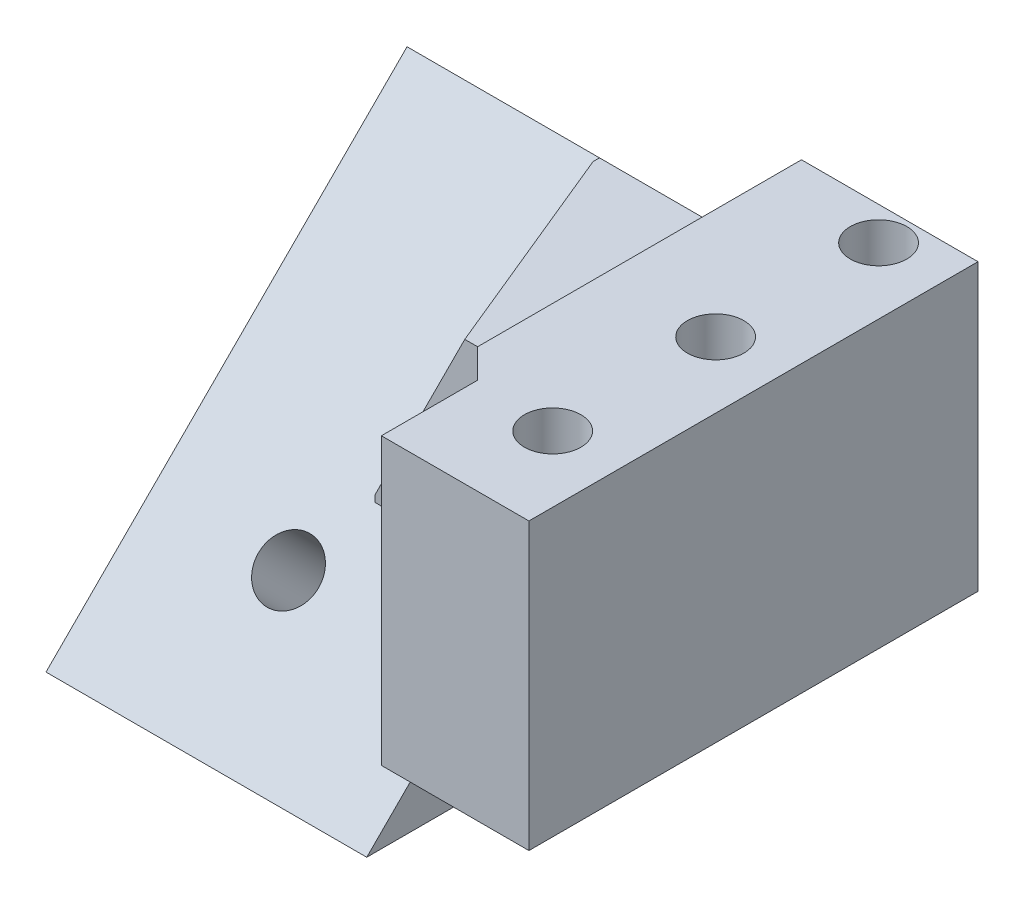
ISO-10303-21;
HEADER;
FILE_DESCRIPTION(('STEP AP214'),'2;1');
FILE_NAME('part.step','',(''),(''),'','','');
FILE_SCHEMA(('AUTOMOTIVE_DESIGN { 1 0 10303 214 1 1 1 1 }'));
ENDSEC;
DATA;
#1=APPLICATION_CONTEXT('core data for automotive mechanical design processes');
#2=APPLICATION_PROTOCOL_DEFINITION('international standard','automotive_design',2000,#1);
#3=PRODUCT_CONTEXT('',#1,'mechanical');
#4=PRODUCT('Part','Part','',(#3));
#5=PRODUCT_RELATED_PRODUCT_CATEGORY('part','',(#4));
#6=PRODUCT_DEFINITION_FORMATION('','',#4);
#7=PRODUCT_DEFINITION_CONTEXT('part definition',#1,'design');
#8=PRODUCT_DEFINITION('design','',#6,#7);
#9=PRODUCT_DEFINITION_SHAPE('','',#8);
#10=(LENGTH_UNIT() NAMED_UNIT(*) SI_UNIT(.MILLI.,.METRE.));
#11=(NAMED_UNIT(*) PLANE_ANGLE_UNIT() SI_UNIT($,.RADIAN.));
#12=(NAMED_UNIT(*) SI_UNIT($,.STERADIAN.) SOLID_ANGLE_UNIT());
#13=UNCERTAINTY_MEASURE_WITH_UNIT(LENGTH_MEASURE(1.E-05),#10,'distance_accuracy_value','');
#14=(GEOMETRIC_REPRESENTATION_CONTEXT(3) GLOBAL_UNCERTAINTY_ASSIGNED_CONTEXT((#13)) GLOBAL_UNIT_ASSIGNED_CONTEXT((#10,
#11,#12)) REPRESENTATION_CONTEXT('',''));
#15=CARTESIAN_POINT('',(0.,0.,0.));
#16=DIRECTION('',(0.,0.,1.));
#17=DIRECTION('',(1.,0.,0.));
#18=AXIS2_PLACEMENT_3D('',#15,#16,#17);
#19=CARTESIAN_POINT('',(-18.,0.,0.));
#20=DIRECTION('',(-1.,0.,0.));
#21=DIRECTION('',(0.,0.,1.));
#22=AXIS2_PLACEMENT_3D('',#19,#20,#21);
#23=PLANE('',#22);
#24=DIRECTION('',(0.,1.,0.));
#25=VECTOR('',#24,1.);
#26=CARTESIAN_POINT('',(-18.,-11.125,0.));
#27=LINE('',#26,#25);
#28=CARTESIAN_POINT('',(-18.,-11.125,0.));
#29=VERTEX_POINT('',#28);
#30=CARTESIAN_POINT('',(-18.,-10.6166544701878,0.));
#31=VERTEX_POINT('',#30);
#32=EDGE_CURVE('E152',#29,#31,#27,.T.);
#33=ORIENTED_EDGE('',*,*,#32,.T.);
#34=DIRECTION('',(0.,0.6357072528611,-0.77193023561705));
#35=VECTOR('',#34,1.);
#36=CARTESIAN_POINT('',(-18.,-6.3262126636789,-5.20982219361792));
#37=LINE('',#36,#35);
#38=CARTESIAN_POINT('',(-18.,3.38334552981223,-17.));
#39=VERTEX_POINT('',#38);
#40=EDGE_CURVE('E11',#31,#39,#37,.T.);
#41=ORIENTED_EDGE('',*,*,#40,.T.);
#42=DIRECTION('',(0.,0.,-1.));
#43=VECTOR('',#42,1.);
#44=CARTESIAN_POINT('',(-18.,3.38334552981223,0.));
#45=LINE('',#44,#43);
#46=CARTESIAN_POINT('',(-18.,3.38334552981223,-17.5));
#47=VERTEX_POINT('',#46);
#48=EDGE_CURVE('E161',#39,#47,#45,.T.);
#49=ORIENTED_EDGE('',*,*,#48,.T.);
#50=DIRECTION('',(0.,0.707106781186548,-0.707106781186548));
#51=VECTOR('',#50,1.);
#52=CARTESIAN_POINT('',(-18.,3.38334552981223,-17.5));
#53=LINE('',#52,#51);
#54=CARTESIAN_POINT('',(-18.,-11.125,-2.99165447018778));
#55=VERTEX_POINT('',#54);
#56=EDGE_CURVE('E234',#55,#47,#53,.T.);
#57=ORIENTED_EDGE('',*,*,#56,.F.);
#58=DIRECTION('',(0.,0.,1.));
#59=VECTOR('',#58,1.);
#60=CARTESIAN_POINT('',(-18.,-11.125,-17.5));
#61=LINE('',#60,#59);
#62=EDGE_CURVE('E160',#55,#29,#61,.T.);
#63=ORIENTED_EDGE('',*,*,#62,.T.);
#64=EDGE_LOOP('',(#33,#41,#49,#57,#63));
#65=FACE_BOUND('',#64,.T.);
#66=ADVANCED_FACE('F32',(#65),#23,.T.);
#67=CARTESIAN_POINT('',(-33.,-24.7559644177361,-17.5));
#68=DIRECTION('',(0.,1.,0.));
#69=DIRECTION('',(0.,0.,1.));
#70=AXIS2_PLACEMENT_3D('',#67,#68,#69);
#71=PLANE('',#70);
#72=DIRECTION('',(1.,0.,0.));
#73=VECTOR('',#72,1.);
#74=CARTESIAN_POINT('',(-33.,-24.7559644177361,-17.5));
#75=LINE('',#74,#73);
#76=CARTESIAN_POINT('',(-33.,-24.7559644177361,-17.5));
#77=VERTEX_POINT('',#76);
#78=CARTESIAN_POINT('',(-8.,-24.7559644177361,-17.5));
#79=VERTEX_POINT('',#78);
#80=EDGE_CURVE('E292',#77,#79,#75,.T.);
#81=ORIENTED_EDGE('',*,*,#80,.T.);
#82=DIRECTION('',(0.,0.,-1.));
#83=VECTOR('',#82,1.);
#84=CARTESIAN_POINT('',(-8.,-24.7559644177361,10.6393099475483));
#85=LINE('',#84,#83);
#86=CARTESIAN_POINT('',(-8.,-24.7559644177361,10.6393099475483));
#87=VERTEX_POINT('',#86);
#88=EDGE_CURVE('E272',#87,#79,#85,.T.);
#89=ORIENTED_EDGE('',*,*,#88,.F.);
#90=DIRECTION('',(1.,0.,0.));
#91=VECTOR('',#90,1.);
#92=CARTESIAN_POINT('',(-33.,-24.7559644177361,10.6393099475483));
#93=LINE('',#92,#91);
#94=CARTESIAN_POINT('',(-33.,-24.7559644177361,10.6393099475483));
#95=VERTEX_POINT('',#94);
#96=EDGE_CURVE('E287',#95,#87,#93,.T.);
#97=ORIENTED_EDGE('',*,*,#96,.F.);
#98=DIRECTION('',(0.,0.,1.));
#99=VECTOR('',#98,1.);
#100=CARTESIAN_POINT('',(-33.,-24.7559644177361,-17.5));
#101=LINE('',#100,#99);
#102=EDGE_CURVE('E285',#77,#95,#101,.T.);
#103=ORIENTED_EDGE('',*,*,#102,.F.);
#104=EDGE_LOOP('',(#81,#89,#97,#103));
#105=FACE_BOUND('',#104,.T.);
#106=DIRECTION('',(-1.,0.,0.));
#107=VECTOR('',#106,1.);
#108=CARTESIAN_POINT('',(-33.,-24.7559644177361,-3.36055635968479));
#109=LINE('',#108,#107);
#110=CARTESIAN_POINT('',(-19.0604235533083,-24.7559644177361,-3.36055635968479));
#111=VERTEX_POINT('',#110);
#112=CARTESIAN_POINT('',(-20.5725978708569,-24.7559644177361,-3.36055635968479));
#113=VERTEX_POINT('',#112);
#114=EDGE_CURVE('E53',#111,#113,#109,.T.);
#115=ORIENTED_EDGE('',*,*,#114,.F.);
#116=CARTESIAN_POINT('',(-22.2572766579003,-24.7559644177361,-6.52310238399309));
#117=DIRECTION('',(0.,1.,0.));
#118=DIRECTION('',(0.,0.,1.));
#119=AXIS2_PLACEMENT_3D('',#116,#117,#118);
#120=ELLIPSE('',#119,4.8761873239032,4.2);
#121=CARTESIAN_POINT('',(-25.4541297624924,-24.7559644177361,-3.36055635968479));
#122=VERTEX_POINT('',#121);
#123=EDGE_CURVE('E156',#122,#111,#120,.F.);
#124=ORIENTED_EDGE('',*,*,#123,.F.);
#125=CARTESIAN_POINT('',(-23.9419554449439,-24.7559644177361,-3.36055635968479));
#126=VERTEX_POINT('',#125);
#127=EDGE_CURVE('E263',#126,#122,#109,.T.);
#128=ORIENTED_EDGE('',*,*,#127,.F.);
#129=CARTESIAN_POINT('',(-22.2572766579004,-24.7559644177361,-5.67760507927857));
#130=DIRECTION('',(0.,1.,0.));
#131=DIRECTION('',(0.,0.,1.));
#132=AXIS2_PLACEMENT_3D('',#129,#130,#131);
#133=ELLIPSE('',#132,3.32340187157677,2.35);
#134=EDGE_CURVE('E249',#126,#113,#133,.T.);
#135=ORIENTED_EDGE('',*,*,#134,.T.);
#136=EDGE_LOOP('',(#115,#124,#128,#135));
#137=FACE_BOUND('',#136,.T.);
#138=ADVANCED_FACE('F265',(#105,#137),#71,.F.);
#139=CARTESIAN_POINT('',(-22.2572766579004,-28.618322184494,-9.53996284603643));
#140=DIRECTION('',(0.,0.707106781186548,0.707106781186547));
#141=DIRECTION('',(0.,-0.707106781186547,0.707106781186548));
#142=AXIS2_PLACEMENT_3D('',#139,#140,#141);
#143=CYLINDRICAL_SURFACE('',#142,2.35);
#144=CARTESIAN_POINT('',(-22.2572766579004,-16.5975069043226,2.48085243413488));
#145=DIRECTION('',(0.,0.707106781186548,0.707106781186547));
#146=DIRECTION('',(0.,-0.707106781186547,0.707106781186548));
#147=AXIS2_PLACEMENT_3D('',#144,#145,#146);
#148=CIRCLE('',#147,2.35);
#149=CARTESIAN_POINT('',(-22.2572766579004,-18.259207840111,4.14255336992326));
#150=VERTEX_POINT('',#149);
#151=EDGE_CURVE('E253',#150,#150,#148,.T.);
#152=ORIENTED_EDGE('',*,*,#151,.T.);
#153=EDGE_LOOP('',(#152));
#154=FACE_BOUND('',#153,.T.);
#155=CARTESIAN_POINT('',(-22.2572766579004,-23.8963235517584,-4.81796421330083));
#156=DIRECTION('',(0.,-0.861328681818987,-0.508048129487715));
#157=DIRECTION('',(0.,-0.508048129487715,0.861328681818987));
#158=AXIS2_PLACEMENT_3D('',#155,#156,#157);
#159=ELLIPSE('',#158,2.42694475628332,2.35);
#160=EDGE_CURVE('E248',#113,#126,#159,.F.);
#161=ORIENTED_EDGE('',*,*,#160,.F.);
#162=ORIENTED_EDGE('',*,*,#134,.F.);
#163=EDGE_LOOP('',(#161,#162));
#164=FACE_BOUND('',#163,.T.);
#165=ADVANCED_FACE('F331',(#154,#164),#143,.F.);
#166=CARTESIAN_POINT('',(11.5,-11.125,17.5));
#167=DIRECTION('',(0.,1.,0.));
#168=DIRECTION('',(0.,0.,1.));
#169=AXIS2_PLACEMENT_3D('',#166,#167,#168);
#170=PLANE('',#169);
#171=CARTESIAN_POINT('',(6.35,-11.125,-14.9));
#172=DIRECTION('',(0.,1.,0.));
#173=DIRECTION('',(0.,0.,1.));
#174=AXIS2_PLACEMENT_3D('',#171,#172,#173);
#175=CIRCLE('',#174,2.2);
#176=CARTESIAN_POINT('',(6.35,-11.125,-12.7));
#177=VERTEX_POINT('',#176);
#178=EDGE_CURVE('E213',#177,#177,#175,.T.);
#179=ORIENTED_EDGE('',*,*,#178,.T.);
#180=EDGE_LOOP('',(#179));
#181=FACE_BOUND('',#180,.T.);
#182=CARTESIAN_POINT('',(6.35,-11.125,10.5));
#183=DIRECTION('',(0.,1.,0.));
#184=DIRECTION('',(0.,0.,1.));
#185=AXIS2_PLACEMENT_3D('',#182,#183,#184);
#186=CIRCLE('',#185,2.2);
#187=CARTESIAN_POINT('',(6.35,-11.125,12.7));
#188=VERTEX_POINT('',#187);
#189=EDGE_CURVE('E181',#188,#188,#186,.T.);
#190=ORIENTED_EDGE('',*,*,#189,.T.);
#191=EDGE_LOOP('',(#190));
#192=FACE_BOUND('',#191,.T.);
#193=CARTESIAN_POINT('',(6.35,-11.125,-2.2));
#194=DIRECTION('',(0.,1.,0.));
#195=DIRECTION('',(0.,0.,1.));
#196=AXIS2_PLACEMENT_3D('',#193,#194,#195);
#197=CIRCLE('',#196,2.2);
#198=CARTESIAN_POINT('',(6.35,-11.125,0.));
#199=VERTEX_POINT('',#198);
#200=EDGE_CURVE('E174',#199,#199,#197,.T.);
#201=ORIENTED_EDGE('',*,*,#200,.T.);
#202=EDGE_LOOP('',(#201));
#203=FACE_BOUND('',#202,.T.);
#204=DIRECTION('',(-1.,0.,0.));
#205=VECTOR('',#204,1.);
#206=CARTESIAN_POINT('',(-8.,-11.125,-2.99165447018778));
#207=LINE('',#206,#205);
#208=CARTESIAN_POINT('',(-1.00000000000003,-11.125,-2.99165447018778));
#209=VERTEX_POINT('',#208);
#210=EDGE_CURVE('E278',#209,#55,#207,.T.);
#211=ORIENTED_EDGE('',*,*,#210,.F.);
#212=DIRECTION('',(0.,0.,-1.));
#213=VECTOR('',#212,1.);
#214=CARTESIAN_POINT('',(-1.00000000000003,-11.125,17.5));
#215=LINE('',#214,#213);
#216=CARTESIAN_POINT('',(-1.00000000000003,-11.125,-17.5));
#217=VERTEX_POINT('',#216);
#218=EDGE_CURVE('E241',#209,#217,#215,.T.);
#219=ORIENTED_EDGE('',*,*,#218,.T.);
#220=DIRECTION('',(-1.,0.,0.));
#221=VECTOR('',#220,1.);
#222=CARTESIAN_POINT('',(11.5,-11.125,-17.5));
#223=LINE('',#222,#221);
#224=CARTESIAN_POINT('',(11.5,-11.125,-17.5));
#225=VERTEX_POINT('',#224);
#226=EDGE_CURVE('E197',#225,#217,#223,.T.);
#227=ORIENTED_EDGE('',*,*,#226,.F.);
#228=DIRECTION('',(0.,0.,-1.));
#229=VECTOR('',#228,1.);
#230=CARTESIAN_POINT('',(11.5,-11.125,17.5));
#231=LINE('',#230,#229);
#232=CARTESIAN_POINT('',(11.5,-11.125,17.5));
#233=VERTEX_POINT('',#232);
#234=EDGE_CURVE('E195',#233,#225,#231,.T.);
#235=ORIENTED_EDGE('',*,*,#234,.F.);
#236=DIRECTION('',(-1.,0.,0.));
#237=VECTOR('',#236,1.);
#238=CARTESIAN_POINT('',(11.5,-11.125,17.5));
#239=LINE('',#238,#237);
#240=CARTESIAN_POINT('',(0.,-11.125,17.5));
#241=VERTEX_POINT('',#240);
#242=EDGE_CURVE('E205',#233,#241,#239,.T.);
#243=ORIENTED_EDGE('',*,*,#242,.T.);
#244=DIRECTION('',(0.,0.,-1.));
#245=VECTOR('',#244,1.);
#246=CARTESIAN_POINT('',(0.,-11.125,17.5));
#247=LINE('',#246,#245);
#248=CARTESIAN_POINT('',(0.,-11.125,10.0000000000001));
#249=VERTEX_POINT('',#248);
#250=EDGE_CURVE('E191',#241,#249,#247,.T.);
#251=ORIENTED_EDGE('',*,*,#250,.T.);
#252=DIRECTION('',(-0.707106781186551,0.,-0.707106781186544));
#253=VECTOR('',#252,1.);
#254=CARTESIAN_POINT('',(9.50000000000002,-11.125,19.5));
#255=LINE('',#254,#253);
#256=CARTESIAN_POINT('',(-10.0000000000002,-11.125,0.));
#257=VERTEX_POINT('',#256);
#258=EDGE_CURVE('E227',#249,#257,#255,.T.);
#259=ORIENTED_EDGE('',*,*,#258,.T.);
#260=DIRECTION('',(1.,0.,0.));
#261=VECTOR('',#260,1.);
#262=CARTESIAN_POINT('',(-18.,-11.125,0.));
#263=LINE('',#262,#261);
#264=EDGE_CURVE('E172',#29,#257,#263,.T.);
#265=ORIENTED_EDGE('',*,*,#264,.F.);
#266=ORIENTED_EDGE('',*,*,#62,.F.);
#267=EDGE_LOOP('',(#211,#219,#227,#235,#243,#251,#259,#265,#266));
#268=FACE_BOUND('',#267,.T.);
#269=ADVANCED_FACE('F304',(#181,#192,#203,#268),#170,.F.);
#270=CARTESIAN_POINT('',(6.35,-11.125,-14.9));
#271=DIRECTION('',(0.,1.,0.));
#272=DIRECTION('',(0.,0.,1.));
#273=AXIS2_PLACEMENT_3D('',#270,#271,#272);
#274=CYLINDRICAL_SURFACE('',#273,2.2);
#275=ORIENTED_EDGE('',*,*,#178,.F.);
#276=EDGE_LOOP('',(#275));
#277=FACE_BOUND('',#276,.T.);
#278=CARTESIAN_POINT('',(6.35,11.125,-14.9));
#279=DIRECTION('',(0.,1.,0.));
#280=DIRECTION('',(0.,0.,1.));
#281=AXIS2_PLACEMENT_3D('',#278,#279,#280);
#282=CIRCLE('',#281,2.2);
#283=CARTESIAN_POINT('',(6.35,11.125,-12.7));
#284=VERTEX_POINT('',#283);
#285=EDGE_CURVE('E216',#284,#284,#282,.T.);
#286=ORIENTED_EDGE('',*,*,#285,.T.);
#287=EDGE_LOOP('',(#286));
#288=FACE_BOUND('',#287,.T.);
#289=ADVANCED_FACE('F444',(#277,#288),#274,.F.);
#290=CARTESIAN_POINT('',(11.5,-11.125,-17.5));
#291=DIRECTION('',(0.,0.,1.));
#292=DIRECTION('',(1.,0.,0.));
#293=AXIS2_PLACEMENT_3D('',#290,#291,#292);
#294=PLANE('',#293);
#295=ORIENTED_EDGE('',*,*,#226,.T.);
#296=DIRECTION('',(-0.707106781186544,-0.707106781186551,0.));
#297=VECTOR('',#296,1.);
#298=CARTESIAN_POINT('',(5.24999999999992,-4.87499999999999,-17.5));
#299=LINE('',#298,#297);
#300=CARTESIAN_POINT('',(-8.,-18.125,-17.5));
#301=VERTEX_POINT('',#300);
#302=EDGE_CURVE('E246',#217,#301,#299,.T.);
#303=ORIENTED_EDGE('',*,*,#302,.T.);
#304=DIRECTION('',(0.,1.,0.));
#305=VECTOR('',#304,1.);
#306=CARTESIAN_POINT('',(-8.,-11.125,-17.5));
#307=LINE('',#306,#305);
#308=EDGE_CURVE('E275',#79,#301,#307,.T.);
#309=ORIENTED_EDGE('',*,*,#308,.F.);
#310=ORIENTED_EDGE('',*,*,#80,.F.);
#311=DIRECTION('',(0.,-1.,0.));
#312=VECTOR('',#311,1.);
#313=CARTESIAN_POINT('',(-33.,-11.125,-17.5));
#314=LINE('',#313,#312);
#315=CARTESIAN_POINT('',(-33.,3.38334552981223,-17.5));
#316=VERTEX_POINT('',#315);
#317=EDGE_CURVE('E283',#316,#77,#314,.T.);
#318=ORIENTED_EDGE('',*,*,#317,.F.);
#319=DIRECTION('',(1.,0.,0.));
#320=VECTOR('',#319,1.);
#321=CARTESIAN_POINT('',(-33.,3.38334552981223,-17.5));
#322=LINE('',#321,#320);
#323=EDGE_CURVE('E237',#316,#47,#322,.T.);
#324=ORIENTED_EDGE('',*,*,#323,.T.);
#325=DIRECTION('',(1.,0.,0.));
#326=VECTOR('',#325,1.);
#327=CARTESIAN_POINT('',(-18.,3.38334552981223,-17.5));
#328=LINE('',#327,#326);
#329=CARTESIAN_POINT('',(-10.0000000000002,3.38334552981223,-17.5));
#330=VERTEX_POINT('',#329);
#331=EDGE_CURVE('E163',#47,#330,#328,.T.);
#332=ORIENTED_EDGE('',*,*,#331,.T.);
#333=DIRECTION('',(0.707106781186551,0.707106781186544,0.));
#334=VECTOR('',#333,1.);
#335=CARTESIAN_POINT('',(-6.50417276490609,6.87917276490627,-17.5));
#336=LINE('',#335,#334);
#337=CARTESIAN_POINT('',(-2.25834552981233,11.125,-17.5));
#338=VERTEX_POINT('',#337);
#339=EDGE_CURVE('E229',#330,#338,#336,.T.);
#340=ORIENTED_EDGE('',*,*,#339,.T.);
#341=DIRECTION('',(-1.,0.,0.));
#342=VECTOR('',#341,1.);
#343=CARTESIAN_POINT('',(11.5,11.125,-17.5));
#344=LINE('',#343,#342);
#345=CARTESIAN_POINT('',(11.5,11.125,-17.5));
#346=VERTEX_POINT('',#345);
#347=EDGE_CURVE('E211',#346,#338,#344,.T.);
#348=ORIENTED_EDGE('',*,*,#347,.F.);
#349=DIRECTION('',(0.,1.,0.));
#350=VECTOR('',#349,1.);
#351=CARTESIAN_POINT('',(11.5,-11.125,-17.5));
#352=LINE('',#351,#350);
#353=EDGE_CURVE('E187',#225,#346,#352,.T.);
#354=ORIENTED_EDGE('',*,*,#353,.F.);
#355=EDGE_LOOP('',(#295,#303,#309,#310,#318,#324,#332,#340,#348,#354));
#356=FACE_BOUND('',#355,.T.);
#357=ADVANCED_FACE('F296',(#356),#294,.F.);
#358=CARTESIAN_POINT('',(11.5,11.125,17.5));
#359=DIRECTION('',(0.,-1.,0.));
#360=DIRECTION('',(0.,0.,-1.));
#361=AXIS2_PLACEMENT_3D('',#358,#359,#360);
#362=PLANE('',#361);
#363=CARTESIAN_POINT('',(6.35,11.125,-2.2));
#364=DIRECTION('',(0.,1.,0.));
#365=DIRECTION('',(0.,0.,1.));
#366=AXIS2_PLACEMENT_3D('',#363,#364,#365);
#367=CIRCLE('',#366,2.2);
#368=CARTESIAN_POINT('',(6.35,11.125,0.));
#369=VERTEX_POINT('',#368);
#370=EDGE_CURVE('E177',#369,#369,#367,.T.);
#371=ORIENTED_EDGE('',*,*,#370,.F.);
#372=EDGE_LOOP('',(#371));
#373=FACE_BOUND('',#372,.T.);
#374=CARTESIAN_POINT('',(6.35,11.125,10.5));
#375=DIRECTION('',(0.,1.,0.));
#376=DIRECTION('',(0.,0.,1.));
#377=AXIS2_PLACEMENT_3D('',#374,#375,#376);
#378=CIRCLE('',#377,2.2);
#379=CARTESIAN_POINT('',(6.35,11.125,12.7));
#380=VERTEX_POINT('',#379);
#381=EDGE_CURVE('E180',#380,#380,#378,.T.);
#382=ORIENTED_EDGE('',*,*,#381,.F.);
#383=EDGE_LOOP('',(#382));
#384=FACE_BOUND('',#383,.T.);
#385=ORIENTED_EDGE('',*,*,#347,.T.);
#386=DIRECTION('',(0.,0.,1.));
#387=VECTOR('',#386,1.);
#388=CARTESIAN_POINT('',(-2.25834552981233,11.125,17.5));
#389=LINE('',#388,#387);
#390=CARTESIAN_POINT('',(-2.25834552981235,11.125,7.74165447018775));
#391=VERTEX_POINT('',#390);
#392=EDGE_CURVE('E232',#338,#391,#389,.T.);
#393=ORIENTED_EDGE('',*,*,#392,.T.);
#394=DIRECTION('',(0.707106781186551,0.,0.707106781186544));
#395=VECTOR('',#394,1.);
#396=CARTESIAN_POINT('',(9.50000000000002,11.125,19.5));
#397=LINE('',#396,#395);
#398=CARTESIAN_POINT('',(0.,11.125,10.0000000000001));
#399=VERTEX_POINT('',#398);
#400=EDGE_CURVE('E225',#391,#399,#397,.T.);
#401=ORIENTED_EDGE('',*,*,#400,.T.);
#402=DIRECTION('',(0.,0.,1.));
#403=VECTOR('',#402,1.);
#404=CARTESIAN_POINT('',(0.,11.125,17.5));
#405=LINE('',#404,#403);
#406=CARTESIAN_POINT('',(0.,11.125,17.5));
#407=VERTEX_POINT('',#406);
#408=EDGE_CURVE('E184',#399,#407,#405,.T.);
#409=ORIENTED_EDGE('',*,*,#408,.T.);
#410=DIRECTION('',(-1.,0.,0.));
#411=VECTOR('',#410,1.);
#412=CARTESIAN_POINT('',(11.5,11.125,17.5));
#413=LINE('',#412,#411);
#414=CARTESIAN_POINT('',(11.5,11.125,17.5));
#415=VERTEX_POINT('',#414);
#416=EDGE_CURVE('E208',#415,#407,#413,.T.);
#417=ORIENTED_EDGE('',*,*,#416,.F.);
#418=DIRECTION('',(0.,0.,1.));
#419=VECTOR('',#418,1.);
#420=CARTESIAN_POINT('',(11.5,11.125,17.5));
#421=LINE('',#420,#419);
#422=EDGE_CURVE('E190',#346,#415,#421,.T.);
#423=ORIENTED_EDGE('',*,*,#422,.F.);
#424=EDGE_LOOP('',(#385,#393,#401,#409,#417,#423));
#425=FACE_BOUND('',#424,.T.);
#426=ORIENTED_EDGE('',*,*,#285,.F.);
#427=EDGE_LOOP('',(#426));
#428=FACE_BOUND('',#427,.T.);
#429=ADVANCED_FACE('F418',(#373,#384,#425,#428),#362,.F.);
#430=CARTESIAN_POINT('',(11.5,-11.125,17.5));
#431=DIRECTION('',(0.,0.,-1.));
#432=DIRECTION('',(-1.,0.,0.));
#433=AXIS2_PLACEMENT_3D('',#430,#431,#432);
#434=PLANE('',#433);
#435=DIRECTION('',(0.,-1.,0.));
#436=VECTOR('',#435,1.);
#437=CARTESIAN_POINT('',(0.,-11.125,17.5));
#438=LINE('',#437,#436);
#439=EDGE_CURVE('E199',#407,#241,#438,.T.);
#440=ORIENTED_EDGE('',*,*,#439,.T.);
#441=ORIENTED_EDGE('',*,*,#242,.F.);
#442=DIRECTION('',(0.,-1.,0.));
#443=VECTOR('',#442,1.);
#444=CARTESIAN_POINT('',(11.5,-11.125,17.5));
#445=LINE('',#444,#443);
#446=EDGE_CURVE('E193',#415,#233,#445,.T.);
#447=ORIENTED_EDGE('',*,*,#446,.F.);
#448=ORIENTED_EDGE('',*,*,#416,.T.);
#449=EDGE_LOOP('',(#440,#441,#447,#448));
#450=FACE_BOUND('',#449,.T.);
#451=ADVANCED_FACE('F423',(#450),#434,.F.);
#452=CARTESIAN_POINT('',(11.5,0.,0.));
#453=DIRECTION('',(-1.,0.,0.));
#454=DIRECTION('',(0.,0.,1.));
#455=AXIS2_PLACEMENT_3D('',#452,#453,#454);
#456=PLANE('',#455);
#457=ORIENTED_EDGE('',*,*,#353,.T.);
#458=ORIENTED_EDGE('',*,*,#422,.T.);
#459=ORIENTED_EDGE('',*,*,#446,.T.);
#460=ORIENTED_EDGE('',*,*,#234,.T.);
#461=EDGE_LOOP('',(#457,#458,#459,#460));
#462=FACE_BOUND('',#461,.T.);
#463=ADVANCED_FACE('F408',(#462),#456,.F.);
#464=CARTESIAN_POINT('',(0.,0.,0.));
#465=DIRECTION('',(-1.,0.,0.));
#466=DIRECTION('',(0.,0.,1.));
#467=AXIS2_PLACEMENT_3D('',#464,#465,#466);
#468=PLANE('',#467);
#469=ORIENTED_EDGE('',*,*,#408,.F.);
#470=DIRECTION('',(0.,-1.,0.));
#471=VECTOR('',#470,1.);
#472=CARTESIAN_POINT('',(0.,0.,10.0000000000001));
#473=LINE('',#472,#471);
#474=EDGE_CURVE('E221',#399,#249,#473,.T.);
#475=ORIENTED_EDGE('',*,*,#474,.T.);
#476=ORIENTED_EDGE('',*,*,#250,.F.);
#477=ORIENTED_EDGE('',*,*,#439,.F.);
#478=EDGE_LOOP('',(#469,#475,#476,#477));
#479=FACE_BOUND('',#478,.T.);
#480=ADVANCED_FACE('F402',(#479),#468,.T.);
#481=CARTESIAN_POINT('',(6.35,-11.125,10.5));
#482=DIRECTION('',(0.,1.,0.));
#483=DIRECTION('',(0.,0.,1.));
#484=AXIS2_PLACEMENT_3D('',#481,#482,#483);
#485=CYLINDRICAL_SURFACE('',#484,2.2);
#486=ORIENTED_EDGE('',*,*,#189,.F.);
#487=EDGE_LOOP('',(#486));
#488=FACE_BOUND('',#487,.T.);
#489=ORIENTED_EDGE('',*,*,#381,.T.);
#490=EDGE_LOOP('',(#489));
#491=FACE_BOUND('',#490,.T.);
#492=ADVANCED_FACE('F407',(#488,#491),#485,.F.);
#493=CARTESIAN_POINT('',(6.35,-11.125,-2.2));
#494=DIRECTION('',(0.,1.,0.));
#495=DIRECTION('',(0.,0.,1.));
#496=AXIS2_PLACEMENT_3D('',#493,#494,#495);
#497=CYLINDRICAL_SURFACE('',#496,2.2);
#498=ORIENTED_EDGE('',*,*,#200,.F.);
#499=EDGE_LOOP('',(#498));
#500=FACE_BOUND('',#499,.T.);
#501=ORIENTED_EDGE('',*,*,#370,.T.);
#502=EDGE_LOOP('',(#501));
#503=FACE_BOUND('',#502,.T.);
#504=ADVANCED_FACE('F324',(#500,#503),#497,.F.);
#505=CARTESIAN_POINT('',(-18.,-11.125,0.));
#506=DIRECTION('',(0.,0.,-1.));
#507=DIRECTION('',(-1.,0.,0.));
#508=AXIS2_PLACEMENT_3D('',#505,#506,#507);
#509=PLANE('',#508);
#510=DIRECTION('',(0.447213595499958,0.894427190999916,0.));
#511=VECTOR('',#510,1.);
#512=CARTESIAN_POINT('',(-18.2033382119249,-11.0233308940376,0.));
#513=LINE('',#512,#511);
#514=CARTESIAN_POINT('',(-11.,3.38334552981223,0.));
#515=VERTEX_POINT('',#514);
#516=EDGE_CURVE('E143',#31,#515,#513,.T.);
#517=ORIENTED_EDGE('',*,*,#516,.F.);
#518=ORIENTED_EDGE('',*,*,#32,.F.);
#519=ORIENTED_EDGE('',*,*,#264,.T.);
#520=DIRECTION('',(0.,1.,0.));
#521=VECTOR('',#520,1.);
#522=CARTESIAN_POINT('',(-10.0000000000002,-11.125,0.));
#523=LINE('',#522,#521);
#524=CARTESIAN_POINT('',(-10.0000000000002,3.38334552981223,0.));
#525=VERTEX_POINT('',#524);
#526=EDGE_CURVE('E219',#257,#525,#523,.T.);
#527=ORIENTED_EDGE('',*,*,#526,.T.);
#528=DIRECTION('',(1.,0.,0.));
#529=VECTOR('',#528,1.);
#530=CARTESIAN_POINT('',(-18.,3.38334552981223,0.));
#531=LINE('',#530,#529);
#532=EDGE_CURVE('E155',#515,#525,#531,.T.);
#533=ORIENTED_EDGE('',*,*,#532,.F.);
#534=EDGE_LOOP('',(#517,#518,#519,#527,#533));
#535=FACE_BOUND('',#534,.T.);
#536=ADVANCED_FACE('F150',(#535),#509,.F.);
#537=CARTESIAN_POINT('',(-18.,3.38334552981223,0.));
#538=DIRECTION('',(0.,-1.,0.));
#539=DIRECTION('',(0.,0.,-1.));
#540=AXIS2_PLACEMENT_3D('',#537,#538,#539);
#541=PLANE('',#540);
#542=DIRECTION('',(-0.380749805254295,0.,-0.924678098474716));
#543=VECTOR('',#542,1.);
#544=CARTESIAN_POINT('',(-12.0147928994083,3.38334552981223,-2.46449704142012));
#545=LINE('',#544,#543);
#546=EDGE_CURVE('E40',#515,#39,#545,.T.);
#547=ORIENTED_EDGE('',*,*,#546,.F.);
#548=ORIENTED_EDGE('',*,*,#532,.T.);
#549=DIRECTION('',(0.,0.,-1.));
#550=VECTOR('',#549,1.);
#551=CARTESIAN_POINT('',(-10.0000000000002,3.38334552981223,0.));
#552=LINE('',#551,#550);
#553=EDGE_CURVE('E223',#525,#330,#552,.T.);
#554=ORIENTED_EDGE('',*,*,#553,.T.);
#555=ORIENTED_EDGE('',*,*,#331,.F.);
#556=ORIENTED_EDGE('',*,*,#48,.F.);
#557=EDGE_LOOP('',(#547,#548,#554,#555,#556));
#558=FACE_BOUND('',#557,.T.);
#559=ADVANCED_FACE('F317',(#558),#541,.F.);
#560=CARTESIAN_POINT('',(-10.0000000000002,3.38334552981223,0.));
#561=DIRECTION('',(0.707106781186544,-0.707106781186551,0.));
#562=DIRECTION('',(0.,0.,-1.));
#563=AXIS2_PLACEMENT_3D('',#560,#561,#562);
#564=PLANE('',#563);
#565=ORIENTED_EDGE('',*,*,#339,.F.);
#566=ORIENTED_EDGE('',*,*,#553,.F.);
#567=DIRECTION('',(-0.57735026918963,-0.577350269189624,-0.577350269189624));
#568=VECTOR('',#567,1.);
#569=CARTESIAN_POINT('',(-14.8361151766043,-1.45276964679181,-4.83611517660404));
#570=LINE('',#569,#568);
#571=EDGE_CURVE('E165',#391,#525,#570,.T.);
#572=ORIENTED_EDGE('',*,*,#571,.F.);
#573=ORIENTED_EDGE('',*,*,#392,.F.);
#574=EDGE_LOOP('',(#565,#566,#572,#573));
#575=FACE_BOUND('',#574,.T.);
#576=ADVANCED_FACE('F315',(#575),#564,.F.);
#577=CARTESIAN_POINT('',(-10.0000000000002,-11.125,0.));
#578=DIRECTION('',(0.707106781186544,0.,-0.707106781186551));
#579=DIRECTION('',(0.,1.,0.));
#580=AXIS2_PLACEMENT_3D('',#577,#578,#579);
#581=PLANE('',#580);
#582=ORIENTED_EDGE('',*,*,#258,.F.);
#583=ORIENTED_EDGE('',*,*,#474,.F.);
#584=ORIENTED_EDGE('',*,*,#400,.F.);
#585=ORIENTED_EDGE('',*,*,#571,.T.);
#586=ORIENTED_EDGE('',*,*,#526,.F.);
#587=EDGE_LOOP('',(#582,#583,#584,#585,#586));
#588=FACE_BOUND('',#587,.T.);
#589=ADVANCED_FACE('F308',(#588),#581,.F.);
#590=CARTESIAN_POINT('',(-33.,3.38334552981223,-17.5));
#591=DIRECTION('',(0.,-0.707106781186547,-0.707106781186547));
#592=DIRECTION('',(0.,0.707106781186548,-0.707106781186548));
#593=AXIS2_PLACEMENT_3D('',#590,#591,#592);
#594=PLANE('',#593);
#595=ORIENTED_EDGE('',*,*,#151,.F.);
#596=EDGE_LOOP('',(#595));
#597=FACE_BOUND('',#596,.T.);
#598=ORIENTED_EDGE('',*,*,#96,.T.);
#599=DIRECTION('',(0.,-0.707106781186547,0.707106781186548));
#600=VECTOR('',#599,1.);
#601=CARTESIAN_POINT('',(-8.,-11.125,-2.99165447018778));
#602=LINE('',#601,#600);
#603=CARTESIAN_POINT('',(-8.,-18.125,4.00834552981227));
#604=VERTEX_POINT('',#603);
#605=EDGE_CURVE('E252',#604,#87,#602,.T.);
#606=ORIENTED_EDGE('',*,*,#605,.F.);
#607=DIRECTION('',(0.577350269189622,0.577350269189628,-0.577350269189628));
#608=VECTOR('',#607,1.);
#609=CARTESIAN_POINT('',(-1.99443631345842,-12.1194363134584,-1.99721815672937));
#610=LINE('',#609,#608);
#611=EDGE_CURVE('E243',#604,#209,#610,.T.);
#612=ORIENTED_EDGE('',*,*,#611,.T.);
#613=ORIENTED_EDGE('',*,*,#210,.T.);
#614=ORIENTED_EDGE('',*,*,#56,.T.);
#615=ORIENTED_EDGE('',*,*,#323,.F.);
#616=DIRECTION('',(0.,0.707106781186548,-0.707106781186548));
#617=VECTOR('',#616,1.);
#618=CARTESIAN_POINT('',(-33.,3.38334552981223,-17.5));
#619=LINE('',#618,#617);
#620=EDGE_CURVE('E280',#95,#316,#619,.T.);
#621=ORIENTED_EDGE('',*,*,#620,.F.);
#622=EDGE_LOOP('',(#598,#606,#612,#613,#614,#615,#621));
#623=FACE_BOUND('',#622,.T.);
#624=ADVANCED_FACE('F302',(#597,#623),#594,.F.);
#625=CARTESIAN_POINT('',(-33.,0.,0.));
#626=DIRECTION('',(-1.,0.,0.));
#627=DIRECTION('',(0.,0.,1.));
#628=AXIS2_PLACEMENT_3D('',#625,#626,#627);
#629=PLANE('',#628);
#630=ORIENTED_EDGE('',*,*,#620,.T.);
#631=ORIENTED_EDGE('',*,*,#317,.T.);
#632=ORIENTED_EDGE('',*,*,#102,.T.);
#633=EDGE_LOOP('',(#630,#631,#632));
#634=FACE_BOUND('',#633,.T.);
#635=ADVANCED_FACE('F336',(#634),#629,.T.);
#636=CARTESIAN_POINT('',(-8.,0.,0.));
#637=DIRECTION('',(1.,0.,0.));
#638=DIRECTION('',(0.,0.,-1.));
#639=AXIS2_PLACEMENT_3D('',#636,#637,#638);
#640=PLANE('',#639);
#641=ORIENTED_EDGE('',*,*,#308,.T.);
#642=DIRECTION('',(0.,0.,1.));
#643=VECTOR('',#642,1.);
#644=CARTESIAN_POINT('',(-8.,-18.125,0.));
#645=LINE('',#644,#643);
#646=EDGE_CURVE('E238',#301,#604,#645,.T.);
#647=ORIENTED_EDGE('',*,*,#646,.T.);
#648=ORIENTED_EDGE('',*,*,#605,.T.);
#649=ORIENTED_EDGE('',*,*,#88,.T.);
#650=EDGE_LOOP('',(#641,#647,#648,#649));
#651=FACE_BOUND('',#650,.T.);
#652=ADVANCED_FACE('F341',(#651),#640,.T.);
#653=CARTESIAN_POINT('',(-8.,-18.125,0.));
#654=DIRECTION('',(-0.707106781186551,0.707106781186544,0.));
#655=DIRECTION('',(0.,0.,1.));
#656=AXIS2_PLACEMENT_3D('',#653,#654,#655);
#657=PLANE('',#656);
#658=ORIENTED_EDGE('',*,*,#302,.F.);
#659=ORIENTED_EDGE('',*,*,#218,.F.);
#660=ORIENTED_EDGE('',*,*,#611,.F.);
#661=ORIENTED_EDGE('',*,*,#646,.F.);
#662=EDGE_LOOP('',(#658,#659,#660,#661));
#663=FACE_BOUND('',#662,.T.);
#664=ADVANCED_FACE('F34',(#663),#657,.F.);
#665=CARTESIAN_POINT('',(-22.2572766579003,-40.5986192178545,-15.8677710420969));
#666=DIRECTION('',(0.,0.861328681818987,0.508048129487715));
#667=DIRECTION('',(0.,-0.508048129487715,0.861328681818987));
#668=AXIS2_PLACEMENT_3D('',#665,#666,#667);
#669=CYLINDRICAL_SURFACE('',#668,4.2);
#670=ORIENTED_EDGE('',*,*,#123,.T.);
#671=CARTESIAN_POINT('',(-22.2572766579003,-23.3720455814748,-5.70680845234257));
#672=DIRECTION('',(0.,-0.861328681818987,-0.508048129487715));
#673=DIRECTION('',(0.,0.508048129487715,-0.861328681818987));
#674=AXIS2_PLACEMENT_3D('',#671,#672,#673);
#675=CIRCLE('',#674,4.2);
#676=EDGE_CURVE('E259',#122,#111,#675,.T.);
#677=ORIENTED_EDGE('',*,*,#676,.F.);
#678=EDGE_LOOP('',(#670,#677));
#679=FACE_BOUND('',#678,.T.);
#680=ADVANCED_FACE('F258',(#679),#669,.F.);
#681=CARTESIAN_POINT('',(-22.2572766579003,-23.3720455814748,-5.70680845234257));
#682=DIRECTION('',(0.,-0.861328681818987,-0.508048129487715));
#683=DIRECTION('',(0.,0.508048129487715,-0.861328681818987));
#684=AXIS2_PLACEMENT_3D('',#681,#682,#683);
#685=PLANE('',#684);
#686=ORIENTED_EDGE('',*,*,#114,.T.);
#687=ORIENTED_EDGE('',*,*,#160,.T.);
#688=ORIENTED_EDGE('',*,*,#127,.T.);
#689=ORIENTED_EDGE('',*,*,#676,.T.);
#690=EDGE_LOOP('',(#686,#687,#688,#689));
#691=FACE_BOUND('',#690,.T.);
#692=ADVANCED_FACE('F262',(#691),#685,.T.);
#693=CARTESIAN_POINT('',(-8.94062993067122,4.47031496533561,3.6814358538058));
#694=DIRECTION('',(-0.839314307639231,0.419657153819616,0.345600009027919));
#695=DIRECTION('',(-0.447213595499958,-0.894427190999916,0.));
#696=AXIS2_PLACEMENT_3D('',#693,#694,#695);
#697=PLANE('',#696);
#698=ORIENTED_EDGE('',*,*,#40,.F.);
#699=ORIENTED_EDGE('',*,*,#516,.T.);
#700=ORIENTED_EDGE('',*,*,#546,.T.);
#701=EDGE_LOOP('',(#698,#699,#700));
#702=FACE_BOUND('',#701,.T.);
#703=ADVANCED_FACE('F142',(#702),#697,.T.);
#704=CLOSED_SHELL('',(#66,#138,#165,#269,#289,#357,#429,#451,#463,#480,#492,#504,#536,#559,#576,
#589,#624,#635,#652,#664,#680,#692,#703));
#705=MANIFOLD_SOLID_BREP('B2',#704);
#706=ADVANCED_BREP_SHAPE_REPRESENTATION('',(#18,#705),#14);
#707=SHAPE_DEFINITION_REPRESENTATION(#9,#706);
ENDSEC;
END-ISO-10303-21;
